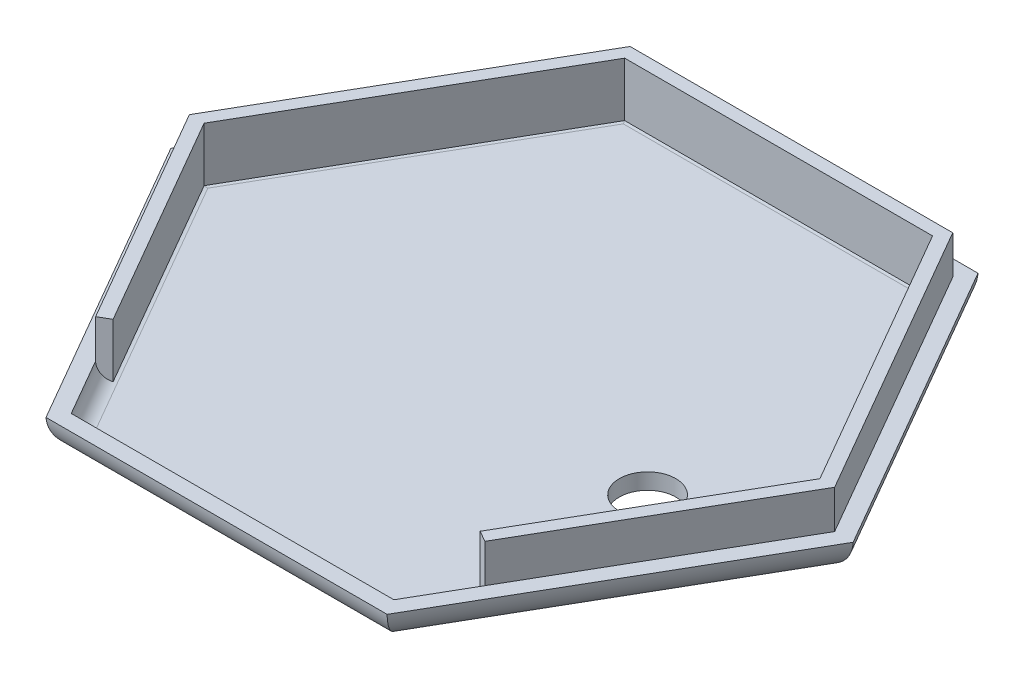
ISO-10303-21;
HEADER;
FILE_DESCRIPTION(('STEP AP214'),'2;1');
FILE_NAME('part.step','',(''),(''),'','','');
FILE_SCHEMA(('AUTOMOTIVE_DESIGN { 1 0 10303 214 1 1 1 1 }'));
ENDSEC;
DATA;
#1=APPLICATION_CONTEXT('core data for automotive mechanical design processes');
#2=APPLICATION_PROTOCOL_DEFINITION('international standard','automotive_design',2000,#1);
#3=PRODUCT_CONTEXT('',#1,'mechanical');
#4=PRODUCT('Part','Part','',(#3));
#5=PRODUCT_RELATED_PRODUCT_CATEGORY('part','',(#4));
#6=PRODUCT_DEFINITION_FORMATION('','',#4);
#7=PRODUCT_DEFINITION_CONTEXT('part definition',#1,'design');
#8=PRODUCT_DEFINITION('design','',#6,#7);
#9=PRODUCT_DEFINITION_SHAPE('','',#8);
#10=(LENGTH_UNIT() NAMED_UNIT(*) SI_UNIT(.MILLI.,.METRE.));
#11=(NAMED_UNIT(*) PLANE_ANGLE_UNIT() SI_UNIT($,.RADIAN.));
#12=(NAMED_UNIT(*) SI_UNIT($,.STERADIAN.) SOLID_ANGLE_UNIT());
#13=UNCERTAINTY_MEASURE_WITH_UNIT(LENGTH_MEASURE(1.E-05),#10,'distance_accuracy_value','');
#14=(GEOMETRIC_REPRESENTATION_CONTEXT(3) GLOBAL_UNCERTAINTY_ASSIGNED_CONTEXT((#13)) GLOBAL_UNIT_ASSIGNED_CONTEXT((#10,
#11,#12)) REPRESENTATION_CONTEXT('',''));
#15=CARTESIAN_POINT('',(0.,0.,0.));
#16=DIRECTION('',(0.,0.,1.));
#17=DIRECTION('',(1.,0.,0.));
#18=AXIS2_PLACEMENT_3D('',#15,#16,#17);
#19=CARTESIAN_POINT('',(0.,0.,0.));
#20=DIRECTION('',(0.,1.,0.));
#21=DIRECTION('',(0.,0.,1.));
#22=AXIS2_PLACEMENT_3D('',#19,#20,#21);
#23=PLANE('',#22);
#24=CARTESIAN_POINT('',(17.4017436721812,0.,1.06507468899997));
#25=DIRECTION('',(0.,1.,0.));
#26=DIRECTION('',(0.,0.,1.));
#27=AXIS2_PLACEMENT_3D('',#24,#25,#26);
#28=CIRCLE('',#27,2.79786320676578);
#29=CARTESIAN_POINT('',(17.4017436721812,0.,3.86293789576575));
#30=VERTEX_POINT('',#29);
#31=EDGE_CURVE('E207',#30,#30,#28,.T.);
#32=ORIENTED_EDGE('',*,*,#31,.T.);
#33=EDGE_LOOP('',(#32));
#34=FACE_BOUND('',#33,.T.);
#35=DIRECTION('',(0.5,0.,-0.866025403784439));
#36=VECTOR('',#35,1.);
#37=CARTESIAN_POINT('',(20.5809107162115,0.,11.8823943421724));
#38=LINE('',#37,#36);
#39=CARTESIAN_POINT('',(29.4451058394209,0.,-3.47084197943052));
#40=VERTEX_POINT('',#39);
#41=CARTESIAN_POINT('',(14.4315622870824,0.,22.533378254868));
#42=VERTEX_POINT('',#41);
#43=EDGE_CURVE('E310',#40,#42,#38,.F.);
#44=ORIENTED_EDGE('',*,*,#43,.T.);
#45=DIRECTION('',(1.,0.,0.));
#46=VECTOR('',#45,1.);
#47=CARTESIAN_POINT('',(0.,0.,22.533378254868));
#48=LINE('',#47,#46);
#49=CARTESIAN_POINT('',(-15.5955248175947,0.,22.533378254868));
#50=VERTEX_POINT('',#49);
#51=EDGE_CURVE('E11',#42,#50,#48,.F.);
#52=ORIENTED_EDGE('',*,*,#51,.T.);
#53=DIRECTION('',(0.5,0.,0.866025403784439));
#54=VECTOR('',#53,1.);
#55=CARTESIAN_POINT('',(-21.4538826140958,0.,12.3864049024108));
#56=LINE('',#55,#54);
#57=CARTESIAN_POINT('',(-30.6090683699332,0.,-3.4708419794305));
#58=VERTEX_POINT('',#57);
#59=EDGE_CURVE('E45',#50,#58,#56,.F.);
#60=ORIENTED_EDGE('',*,*,#59,.T.);
#61=DIRECTION('',(-0.5,0.,0.866025403784439));
#62=VECTOR('',#61,1.);
#63=CARTESIAN_POINT('',(-24.459719940804,0.,-14.1218258921261));
#64=LINE('',#63,#62);
#65=CARTESIAN_POINT('',(-15.5955248175947,0.,-29.475062213729));
#66=VERTEX_POINT('',#65);
#67=EDGE_CURVE('E314',#58,#66,#64,.F.);
#68=ORIENTED_EDGE('',*,*,#67,.T.);
#69=DIRECTION('',(-1.,0.,0.));
#70=VECTOR('',#69,1.);
#71=CARTESIAN_POINT('',(0.,0.,-29.475062213729));
#72=LINE('',#71,#70);
#73=CARTESIAN_POINT('',(14.4315622870824,0.,-29.475062213729));
#74=VERTEX_POINT('',#73);
#75=EDGE_CURVE('E312',#66,#74,#72,.F.);
#76=ORIENTED_EDGE('',*,*,#75,.T.);
#77=DIRECTION('',(-0.5,0.,-0.866025403784439));
#78=VECTOR('',#77,1.);
#79=CARTESIAN_POINT('',(23.5867480429198,0.,-13.6178153318876));
#80=LINE('',#79,#78);
#81=EDGE_CURVE('E293',#74,#40,#80,.F.);
#82=ORIENTED_EDGE('',*,*,#81,.T.);
#83=EDGE_LOOP('',(#44,#52,#60,#68,#76,#82));
#84=FACE_BOUND('',#83,.T.);
#85=ADVANCED_FACE('F36',(#34,#84),#23,.F.);
#86=CARTESIAN_POINT('',(0.,3.175,0.));
#87=DIRECTION('',(0.,1.,0.));
#88=DIRECTION('',(0.,0.,1.));
#89=AXIS2_PLACEMENT_3D('',#86,#87,#88);
#90=PLANE('',#89);
#91=DIRECTION('',(-0.5,0.,-0.866025403784439));
#92=VECTOR('',#91,1.);
#93=CARTESIAN_POINT('',(26.4442480429198,3.175,-15.267593726097));
#94=LINE('',#93,#92);
#95=CARTESIAN_POINT('',(33.2551058394209,3.175,-3.47084197943051));
#96=VERTEX_POINT('',#95);
#97=CARTESIAN_POINT('',(16.3365622870824,3.175,-32.7746190021477));
#98=VERTEX_POINT('',#97);
#99=EDGE_CURVE('E247',#96,#98,#94,.T.);
#100=ORIENTED_EDGE('',*,*,#99,.T.);
#101=DIRECTION('',(-1.,0.,0.));
#102=VECTOR('',#101,1.);
#103=CARTESIAN_POINT('',(0.,3.175,-32.7746190021477));
#104=LINE('',#103,#102);
#105=CARTESIAN_POINT('',(-17.5005248175946,3.175,-32.7746190021477));
#106=VERTEX_POINT('',#105);
#107=EDGE_CURVE('E249',#98,#106,#104,.T.);
#108=ORIENTED_EDGE('',*,*,#107,.T.);
#109=DIRECTION('',(-0.5,0.,0.866025403784439));
#110=VECTOR('',#109,1.);
#111=CARTESIAN_POINT('',(-27.317219940804,3.175,-15.7716042863354));
#112=LINE('',#111,#110);
#113=CARTESIAN_POINT('',(-34.4190683699332,3.175,-3.4708419794305));
#114=VERTEX_POINT('',#113);
#115=EDGE_CURVE('E252',#106,#114,#112,.T.);
#116=ORIENTED_EDGE('',*,*,#115,.T.);
#117=DIRECTION('',(0.5,0.,0.866025403784439));
#118=VECTOR('',#117,1.);
#119=CARTESIAN_POINT('',(-24.3113826140958,3.175,14.0361832966202));
#120=LINE('',#119,#118);
#121=CARTESIAN_POINT('',(-17.5005248175947,3.175,25.8329350432867));
#122=VERTEX_POINT('',#121);
#123=EDGE_CURVE('E254',#114,#122,#120,.T.);
#124=ORIENTED_EDGE('',*,*,#123,.T.);
#125=DIRECTION('',(1.,0.,0.));
#126=VECTOR('',#125,1.);
#127=CARTESIAN_POINT('',(0.,3.175,25.8329350432867));
#128=LINE('',#127,#126);
#129=CARTESIAN_POINT('',(16.3365622870824,3.175,25.8329350432867));
#130=VERTEX_POINT('',#129);
#131=EDGE_CURVE('E256',#122,#130,#128,.T.);
#132=ORIENTED_EDGE('',*,*,#131,.T.);
#133=DIRECTION('',(0.5,0.,-0.866025403784439));
#134=VECTOR('',#133,1.);
#135=CARTESIAN_POINT('',(23.4384107162115,3.175,13.5321727363817));
#136=LINE('',#135,#134);
#137=EDGE_CURVE('E259',#130,#96,#136,.T.);
#138=ORIENTED_EDGE('',*,*,#137,.T.);
#139=EDGE_LOOP('',(#100,#108,#116,#124,#132,#138));
#140=FACE_BOUND('',#139,.T.);
#141=DIRECTION('',(-0.5,0.,-0.866025403784439));
#142=VECTOR('',#141,1.);
#143=CARTESIAN_POINT('',(-22.936567285588,3.175,13.2424332966202));
#144=LINE('',#143,#142);
#145=CARTESIAN_POINT('',(-16.5839812652561,3.175,24.2454350432867));
#146=VERTEX_POINT('',#145);
#147=CARTESIAN_POINT('',(-19.8859812652561,3.175,18.5262032766942));
#148=VERTEX_POINT('',#147);
#149=EDGE_CURVE('E261',#146,#148,#144,.T.);
#150=ORIENTED_EDGE('',*,*,#149,.T.);
#151=DIRECTION('',(0.5,0.,0.866025403784439));
#152=VECTOR('',#151,1.);
#153=CARTESIAN_POINT('',(-32.5859812652561,3.175,-3.47084197943051));
#154=LINE('',#153,#152);
#155=CARTESIAN_POINT('',(-32.5859812652561,3.175,-3.47084197943051));
#156=VERTEX_POINT('',#155);
#157=EDGE_CURVE('E211',#156,#148,#154,.T.);
#158=ORIENTED_EDGE('',*,*,#157,.F.);
#159=DIRECTION('',(0.5,0.,-0.866025403784439));
#160=VECTOR('',#159,1.);
#161=CARTESIAN_POINT('',(-25.9424046122962,3.175,-14.9778542863354));
#162=LINE('',#161,#160);
#163=CARTESIAN_POINT('',(-16.5839812652561,3.175,-31.1871190021477));
#164=VERTEX_POINT('',#163);
#165=EDGE_CURVE('E264',#156,#164,#162,.T.);
#166=ORIENTED_EDGE('',*,*,#165,.T.);
#167=DIRECTION('',(1.,0.,0.));
#168=VECTOR('',#167,1.);
#169=CARTESIAN_POINT('',(0.,3.175,-31.1871190021477));
#170=LINE('',#169,#168);
#171=CARTESIAN_POINT('',(15.4200187347439,3.175,-31.1871190021477));
#172=VERTEX_POINT('',#171);
#173=EDGE_CURVE('E267',#164,#172,#170,.T.);
#174=ORIENTED_EDGE('',*,*,#173,.T.);
#175=DIRECTION('',(0.5,0.,0.866025403784439));
#176=VECTOR('',#175,1.);
#177=CARTESIAN_POINT('',(25.069432714412,3.175,-14.473843726097));
#178=LINE('',#177,#176);
#179=CARTESIAN_POINT('',(31.4220187347439,3.175,-3.47084197943051));
#180=VERTEX_POINT('',#179);
#181=EDGE_CURVE('E270',#172,#180,#178,.T.);
#182=ORIENTED_EDGE('',*,*,#181,.T.);
#183=DIRECTION('',(-0.5,0.,0.866025403784439));
#184=VECTOR('',#183,1.);
#185=CARTESIAN_POINT('',(22.0635953877038,3.175,12.7384227363817));
#186=LINE('',#185,#184);
#187=CARTESIAN_POINT('',(18.7220187347439,3.175,18.5262032766942));
#188=VERTEX_POINT('',#187);
#189=EDGE_CURVE('E274',#180,#188,#186,.T.);
#190=ORIENTED_EDGE('',*,*,#189,.T.);
#191=CARTESIAN_POINT('',(15.4200187347439,3.175,24.2454350432867));
#192=VERTEX_POINT('',#191);
#193=EDGE_CURVE('E273',#188,#192,#186,.T.);
#194=ORIENTED_EDGE('',*,*,#193,.T.);
#195=DIRECTION('',(-1.,0.,0.));
#196=VECTOR('',#195,1.);
#197=CARTESIAN_POINT('',(0.,3.175,24.2454350432867));
#198=LINE('',#197,#196);
#199=EDGE_CURVE('E277',#192,#146,#198,.T.);
#200=ORIENTED_EDGE('',*,*,#199,.T.);
#201=EDGE_LOOP('',(#150,#158,#166,#174,#182,#190,#194,#200));
#202=FACE_BOUND('',#201,.T.);
#203=ADVANCED_FACE('F348',(#140,#202),#90,.T.);
#204=CARTESIAN_POINT('',(0.,1.5875,0.));
#205=DIRECTION('',(0.,1.,0.));
#206=DIRECTION('',(0.,0.,1.));
#207=AXIS2_PLACEMENT_3D('',#204,#205,#206);
#208=PLANE('',#207);
#209=CARTESIAN_POINT('',(17.4017436721812,1.5875,1.06507468899997));
#210=DIRECTION('',(0.,1.,0.));
#211=DIRECTION('',(0.,0.,1.));
#212=AXIS2_PLACEMENT_3D('',#209,#210,#211);
#213=CIRCLE('',#212,2.79786320676578);
#214=CARTESIAN_POINT('',(17.4017436721812,1.5875,3.86293789576575));
#215=VERTEX_POINT('',#214);
#216=EDGE_CURVE('E456',#215,#215,#213,.T.);
#217=ORIENTED_EDGE('',*,*,#216,.F.);
#218=EDGE_LOOP('',(#217));
#219=FACE_BOUND('',#218,.T.);
#220=DIRECTION('',(0.5,0.,0.866025403784439));
#221=VECTOR('',#220,1.);
#222=CARTESIAN_POINT('',(23.6946173859043,1.5875,-13.680093726097));
#223=LINE('',#222,#221);
#224=CARTESIAN_POINT('',(29.5889316300668,1.5875,-3.47084197943052));
#225=VERTEX_POINT('',#224);
#226=CARTESIAN_POINT('',(14.5034751824053,1.5875,-29.5996190021477));
#227=VERTEX_POINT('',#226);
#228=EDGE_CURVE('E288',#225,#227,#223,.F.);
#229=ORIENTED_EDGE('',*,*,#228,.T.);
#230=DIRECTION('',(1.,0.,0.));
#231=VECTOR('',#230,1.);
#232=CARTESIAN_POINT('',(0.,1.5875,-29.5996190021477));
#233=LINE('',#232,#231);
#234=CARTESIAN_POINT('',(-15.6674377129176,1.5875,-29.5996190021477));
#235=VERTEX_POINT('',#234);
#236=EDGE_CURVE('E290',#227,#235,#233,.F.);
#237=ORIENTED_EDGE('',*,*,#236,.T.);
#238=DIRECTION('',(0.5,0.,-0.866025403784439));
#239=VECTOR('',#238,1.);
#240=CARTESIAN_POINT('',(-24.5675892837884,1.5875,-14.1841042863354));
#241=LINE('',#240,#239);
#242=CARTESIAN_POINT('',(-30.7528941605791,1.5875,-3.47084197943051));
#243=VERTEX_POINT('',#242);
#244=EDGE_CURVE('E283',#235,#243,#241,.F.);
#245=ORIENTED_EDGE('',*,*,#244,.T.);
#246=DIRECTION('',(-0.5,0.,-0.866025403784439));
#247=VECTOR('',#246,1.);
#248=CARTESIAN_POINT('',(-21.5617519570802,1.5875,12.4486832966202));
#249=LINE('',#248,#247);
#250=CARTESIAN_POINT('',(-15.6674377129176,1.5875,22.6579350432867));
#251=VERTEX_POINT('',#250);
#252=EDGE_CURVE('E279',#243,#251,#249,.F.);
#253=ORIENTED_EDGE('',*,*,#252,.T.);
#254=DIRECTION('',(-1.,0.,0.));
#255=VECTOR('',#254,1.);
#256=CARTESIAN_POINT('',(0.,1.5875,22.6579350432867));
#257=LINE('',#256,#255);
#258=CARTESIAN_POINT('',(14.5034751824053,1.5875,22.6579350432867));
#259=VERTEX_POINT('',#258);
#260=EDGE_CURVE('E281',#251,#259,#257,.F.);
#261=ORIENTED_EDGE('',*,*,#260,.T.);
#262=DIRECTION('',(-0.5,0.,0.866025403784439));
#263=VECTOR('',#262,1.);
#264=CARTESIAN_POINT('',(20.688780059196,1.5875,11.9446727363817));
#265=LINE('',#264,#263);
#266=EDGE_CURVE('E286',#259,#225,#265,.F.);
#267=ORIENTED_EDGE('',*,*,#266,.T.);
#268=EDGE_LOOP('',(#229,#237,#245,#253,#261,#267));
#269=FACE_BOUND('',#268,.T.);
#270=ADVANCED_FACE('F367',(#219,#269),#208,.T.);
#271=CARTESIAN_POINT('',(0.,3.175,22.6579350432867));
#272=DIRECTION('',(-1.,0.,0.));
#273=DIRECTION('',(0.,0.,1.));
#274=AXIS2_PLACEMENT_3D('',#271,#272,#273);
#275=CYLINDRICAL_SURFACE('',#274,1.5875);
#276=CARTESIAN_POINT('',(14.5034751824053,3.175,22.6579350432867));
#277=DIRECTION('',(-0.866025403784439,0.,0.5));
#278=DIRECTION('',(0.5,0.,0.866025403784439));
#279=AXIS2_PLACEMENT_3D('',#276,#277,#278);
#280=ELLIPSE('',#279,1.83308710467706,1.5875);
#281=EDGE_CURVE('E304',#259,#192,#280,.T.);
#282=ORIENTED_EDGE('',*,*,#281,.F.);
#283=ORIENTED_EDGE('',*,*,#260,.F.);
#284=CARTESIAN_POINT('',(-15.6674377129176,3.175,22.6579350432867));
#285=DIRECTION('',(-0.866025403784438,0.,-0.5));
#286=DIRECTION('',(-0.5,0.,0.866025403784439));
#287=AXIS2_PLACEMENT_3D('',#284,#285,#286);
#288=ELLIPSE('',#287,1.83308710467706,1.5875);
#289=EDGE_CURVE('E250',#146,#251,#288,.F.);
#290=ORIENTED_EDGE('',*,*,#289,.F.);
#291=ORIENTED_EDGE('',*,*,#199,.F.);
#292=EDGE_LOOP('',(#282,#283,#290,#291));
#293=FACE_BOUND('',#292,.T.);
#294=ADVANCED_FACE('F391',(#293),#275,.F.);
#295=CARTESIAN_POINT('',(-21.5617519570802,3.175,12.4486832966202));
#296=DIRECTION('',(-0.5,0.,-0.866025403784439));
#297=DIRECTION('',(-0.866025403784439,0.,0.5));
#298=AXIS2_PLACEMENT_3D('',#295,#296,#297);
#299=CYLINDRICAL_SURFACE('',#298,1.5875);
#300=CARTESIAN_POINT('',(-30.7528941605791,3.175,-3.47084197943051));
#301=DIRECTION('',(0.,0.,-1.));
#302=DIRECTION('',(1.,0.,0.));
#303=AXIS2_PLACEMENT_3D('',#300,#301,#302);
#304=ELLIPSE('',#303,1.83308710467706,1.5875);
#305=CARTESIAN_POINT('',(-31.1195115815145,1.6195740130911,-3.47084197943051));
#306=VERTEX_POINT('',#305);
#307=EDGE_CURVE('E302',#306,#243,#304,.F.);
#308=ORIENTED_EDGE('',*,*,#307,.F.);
#309=DIRECTION('',(-0.5,0.,-0.866025403784439));
#310=VECTOR('',#309,1.);
#311=CARTESIAN_POINT('',(-21.8367150227817,1.61957401333268,12.6074332966202));
#312=LINE('',#311,#310);
#313=CARTESIAN_POINT('',(-18.7861290024499,1.61957401331847,17.8912032766942));
#314=VERTEX_POINT('',#313);
#315=EDGE_CURVE('E233',#314,#306,#312,.T.);
#316=ORIENTED_EDGE('',*,*,#315,.F.);
#317=CARTESIAN_POINT('',(-18.5111659367483,3.175,17.7324532766942));
#318=DIRECTION('',(0.499999999999996,0.,0.866025403784441));
#319=DIRECTION('',(0.866025403784441,0.,-0.499999999999996));
#320=AXIS2_PLACEMENT_3D('',#317,#318,#319);
#321=CIRCLE('',#320,1.5875);
#322=EDGE_CURVE('E235',#148,#314,#321,.T.);
#323=ORIENTED_EDGE('',*,*,#322,.F.);
#324=ORIENTED_EDGE('',*,*,#149,.F.);
#325=ORIENTED_EDGE('',*,*,#289,.T.);
#326=ORIENTED_EDGE('',*,*,#252,.F.);
#327=EDGE_LOOP('',(#308,#316,#323,#324,#325,#326));
#328=FACE_BOUND('',#327,.T.);
#329=ADVANCED_FACE('F387',(#328),#299,.F.);
#330=CARTESIAN_POINT('',(20.688780059196,3.175,11.9446727363817));
#331=DIRECTION('',(-0.5,0.,0.866025403784439));
#332=DIRECTION('',(0.866025403784439,0.,0.5));
#333=AXIS2_PLACEMENT_3D('',#330,#331,#332);
#334=CYLINDRICAL_SURFACE('',#333,1.5875);
#335=ORIENTED_EDGE('',*,*,#193,.F.);
#336=CARTESIAN_POINT('',(17.3472034062361,3.175,17.7324532766942));
#337=DIRECTION('',(-0.499999999999995,0.,0.866025403784442));
#338=DIRECTION('',(0.866025403784442,0.,0.499999999999995));
#339=AXIS2_PLACEMENT_3D('',#336,#337,#338);
#340=CIRCLE('',#339,1.5875);
#341=CARTESIAN_POINT('',(17.6221664719376,1.61957401333268,17.8912032766942));
#342=VERTEX_POINT('',#341);
#343=EDGE_CURVE('E223',#342,#188,#340,.T.);
#344=ORIENTED_EDGE('',*,*,#343,.F.);
#345=DIRECTION('',(-0.5,0.,0.866025403784439));
#346=VECTOR('',#345,1.);
#347=CARTESIAN_POINT('',(20.9637431248975,1.61957401333268,12.1034227363818));
#348=LINE('',#347,#346);
#349=CARTESIAN_POINT('',(29.9555490510022,1.61957401331847,-3.4708419794305));
#350=VERTEX_POINT('',#349);
#351=EDGE_CURVE('E244',#350,#342,#348,.T.);
#352=ORIENTED_EDGE('',*,*,#351,.F.);
#353=CARTESIAN_POINT('',(29.5889316300668,3.175,-3.47084197943052));
#354=DIRECTION('',(0.,0.,1.));
#355=DIRECTION('',(1.,0.,0.));
#356=AXIS2_PLACEMENT_3D('',#353,#354,#355);
#357=ELLIPSE('',#356,1.83308710467706,1.5875);
#358=EDGE_CURVE('E299',#225,#350,#357,.T.);
#359=ORIENTED_EDGE('',*,*,#358,.F.);
#360=ORIENTED_EDGE('',*,*,#266,.F.);
#361=ORIENTED_EDGE('',*,*,#281,.T.);
#362=EDGE_LOOP('',(#335,#344,#352,#359,#360,#361));
#363=FACE_BOUND('',#362,.T.);
#364=ADVANCED_FACE('F383',(#363),#334,.F.);
#365=CARTESIAN_POINT('',(-24.5675892837884,3.175,-14.1841042863354));
#366=DIRECTION('',(0.5,0.,-0.866025403784439));
#367=DIRECTION('',(-0.866025403784439,0.,-0.5));
#368=AXIS2_PLACEMENT_3D('',#365,#366,#367);
#369=CYLINDRICAL_SURFACE('',#368,1.5875);
#370=CARTESIAN_POINT('',(-15.6674377129176,3.175,-29.5996190021477));
#371=DIRECTION('',(0.866025403784439,0.,-0.5));
#372=DIRECTION('',(0.5,0.,0.866025403784439));
#373=AXIS2_PLACEMENT_3D('',#370,#371,#372);
#374=ELLIPSE('',#373,1.83308710467706,1.5875);
#375=CARTESIAN_POINT('',(-15.8507464233853,1.61957401331847,-29.9171190021477));
#376=VERTEX_POINT('',#375);
#377=EDGE_CURVE('E297',#376,#235,#374,.F.);
#378=ORIENTED_EDGE('',*,*,#377,.F.);
#379=DIRECTION('',(0.5,0.,-0.866025403784439));
#380=VECTOR('',#379,1.);
#381=CARTESIAN_POINT('',(-24.84255234949,1.61957401333268,-14.3428542863354));
#382=LINE('',#381,#380);
#383=EDGE_CURVE('E236',#306,#376,#382,.T.);
#384=ORIENTED_EDGE('',*,*,#383,.F.);
#385=ORIENTED_EDGE('',*,*,#307,.T.);
#386=ORIENTED_EDGE('',*,*,#244,.F.);
#387=EDGE_LOOP('',(#378,#384,#385,#386));
#388=FACE_BOUND('',#387,.T.);
#389=ADVANCED_FACE('F379',(#388),#369,.F.);
#390=CARTESIAN_POINT('',(23.6946173859043,3.175,-13.680093726097));
#391=DIRECTION('',(0.5,0.,0.866025403784439));
#392=DIRECTION('',(0.866025403784439,0.,-0.5));
#393=AXIS2_PLACEMENT_3D('',#390,#391,#392);
#394=CYLINDRICAL_SURFACE('',#393,1.5875);
#395=ORIENTED_EDGE('',*,*,#358,.T.);
#396=DIRECTION('',(0.5,0.,0.866025403784439));
#397=VECTOR('',#396,1.);
#398=CARTESIAN_POINT('',(23.9695804516058,1.61957401333268,-13.838843726097));
#399=LINE('',#398,#397);
#400=CARTESIAN_POINT('',(14.686783892873,1.61957401331847,-29.9171190021477));
#401=VERTEX_POINT('',#400);
#402=EDGE_CURVE('E242',#401,#350,#399,.T.);
#403=ORIENTED_EDGE('',*,*,#402,.F.);
#404=CARTESIAN_POINT('',(14.5034751824053,3.175,-29.5996190021477));
#405=DIRECTION('',(0.866025403784439,0.,0.5));
#406=DIRECTION('',(0.5,0.,-0.866025403784439));
#407=AXIS2_PLACEMENT_3D('',#404,#405,#406);
#408=ELLIPSE('',#407,1.83308710467706,1.5875);
#409=EDGE_CURVE('E294',#227,#401,#408,.T.);
#410=ORIENTED_EDGE('',*,*,#409,.F.);
#411=ORIENTED_EDGE('',*,*,#228,.F.);
#412=EDGE_LOOP('',(#395,#403,#410,#411));
#413=FACE_BOUND('',#412,.T.);
#414=ADVANCED_FACE('F375',(#413),#394,.F.);
#415=CARTESIAN_POINT('',(0.,3.175,-29.5996190021477));
#416=DIRECTION('',(1.,0.,0.));
#417=DIRECTION('',(0.,0.,-1.));
#418=AXIS2_PLACEMENT_3D('',#415,#416,#417);
#419=CYLINDRICAL_SURFACE('',#418,1.5875);
#420=ORIENTED_EDGE('',*,*,#409,.T.);
#421=DIRECTION('',(1.,0.,0.));
#422=VECTOR('',#421,1.);
#423=CARTESIAN_POINT('',(0.,1.61957401333268,-29.9171190021477));
#424=LINE('',#423,#422);
#425=EDGE_CURVE('E240',#376,#401,#424,.T.);
#426=ORIENTED_EDGE('',*,*,#425,.F.);
#427=ORIENTED_EDGE('',*,*,#377,.T.);
#428=ORIENTED_EDGE('',*,*,#236,.F.);
#429=EDGE_LOOP('',(#420,#426,#427,#428));
#430=FACE_BOUND('',#429,.T.);
#431=ADVANCED_FACE('F372',(#430),#419,.F.);
#432=CARTESIAN_POINT('',(0.,3.302,-29.475062213729));
#433=DIRECTION('',(-1.,0.,0.));
#434=DIRECTION('',(0.,0.,1.));
#435=AXIS2_PLACEMENT_3D('',#432,#433,#434);
#436=CYLINDRICAL_SURFACE('',#435,3.302);
#437=CARTESIAN_POINT('',(14.4315622870824,3.302,-29.475062213729));
#438=DIRECTION('',(-0.866025403784439,0.,-0.5));
#439=DIRECTION('',(0.5,0.,-0.866025403784439));
#440=AXIS2_PLACEMENT_3D('',#437,#438,#439);
#441=ELLIPSE('',#440,3.81282117772829,3.302);
#442=EDGE_CURVE('E324',#74,#98,#441,.F.);
#443=ORIENTED_EDGE('',*,*,#442,.F.);
#444=ORIENTED_EDGE('',*,*,#75,.F.);
#445=CARTESIAN_POINT('',(-15.5955248175947,3.302,-29.475062213729));
#446=DIRECTION('',(-0.866025403784439,0.,0.5));
#447=DIRECTION('',(-0.5,0.,-0.866025403784439));
#448=AXIS2_PLACEMENT_3D('',#445,#446,#447);
#449=ELLIPSE('',#448,3.81282117772829,3.302);
#450=EDGE_CURVE('E40',#106,#66,#449,.T.);
#451=ORIENTED_EDGE('',*,*,#450,.F.);
#452=ORIENTED_EDGE('',*,*,#107,.F.);
#453=EDGE_LOOP('',(#443,#444,#451,#452));
#454=FACE_BOUND('',#453,.T.);
#455=ADVANCED_FACE('F38',(#454),#436,.T.);
#456=CARTESIAN_POINT('',(-24.459719940804,3.302,-14.1218258921261));
#457=DIRECTION('',(-0.5,0.,0.866025403784439));
#458=DIRECTION('',(0.866025403784439,0.,0.5));
#459=AXIS2_PLACEMENT_3D('',#456,#457,#458);
#460=CYLINDRICAL_SURFACE('',#459,3.302);
#461=ORIENTED_EDGE('',*,*,#450,.T.);
#462=ORIENTED_EDGE('',*,*,#67,.F.);
#463=CARTESIAN_POINT('',(-30.6090683699332,3.302,-3.47084197943049));
#464=DIRECTION('',(0.,0.,1.));
#465=DIRECTION('',(-1.,0.,0.));
#466=AXIS2_PLACEMENT_3D('',#463,#464,#465);
#467=ELLIPSE('',#466,3.81282117772829,3.302);
#468=EDGE_CURVE('E322',#114,#58,#467,.T.);
#469=ORIENTED_EDGE('',*,*,#468,.F.);
#470=ORIENTED_EDGE('',*,*,#115,.F.);
#471=EDGE_LOOP('',(#461,#462,#469,#470));
#472=FACE_BOUND('',#471,.T.);
#473=ADVANCED_FACE('F334',(#472),#460,.T.);
#474=CARTESIAN_POINT('',(23.5867480429198,3.302,-13.6178153318876));
#475=DIRECTION('',(-0.5,0.,-0.866025403784439));
#476=DIRECTION('',(-0.866025403784439,0.,0.5));
#477=AXIS2_PLACEMENT_3D('',#474,#475,#476);
#478=CYLINDRICAL_SURFACE('',#477,3.302);
#479=ORIENTED_EDGE('',*,*,#442,.T.);
#480=ORIENTED_EDGE('',*,*,#99,.F.);
#481=CARTESIAN_POINT('',(29.4451058394209,3.302,-3.47084197943052));
#482=DIRECTION('',(0.,0.,-1.));
#483=DIRECTION('',(-1.,0.,0.));
#484=AXIS2_PLACEMENT_3D('',#481,#482,#483);
#485=ELLIPSE('',#484,3.81282117772829,3.302);
#486=EDGE_CURVE('E319',#40,#96,#485,.F.);
#487=ORIENTED_EDGE('',*,*,#486,.F.);
#488=ORIENTED_EDGE('',*,*,#81,.F.);
#489=EDGE_LOOP('',(#479,#480,#487,#488));
#490=FACE_BOUND('',#489,.T.);
#491=ADVANCED_FACE('F341',(#490),#478,.T.);
#492=CARTESIAN_POINT('',(-21.4538826140958,3.302,12.3864049024108));
#493=DIRECTION('',(0.5,0.,0.866025403784439));
#494=DIRECTION('',(0.866025403784439,0.,-0.5));
#495=AXIS2_PLACEMENT_3D('',#492,#493,#494);
#496=CYLINDRICAL_SURFACE('',#495,3.302);
#497=ORIENTED_EDGE('',*,*,#468,.T.);
#498=ORIENTED_EDGE('',*,*,#59,.F.);
#499=CARTESIAN_POINT('',(-15.5955248175947,3.302,22.533378254868));
#500=DIRECTION('',(0.866025403784438,0.,0.5));
#501=DIRECTION('',(-0.5,0.,0.866025403784439));
#502=AXIS2_PLACEMENT_3D('',#499,#500,#501);
#503=ELLIPSE('',#502,3.81282117772829,3.302);
#504=EDGE_CURVE('E53',#122,#50,#503,.T.);
#505=ORIENTED_EDGE('',*,*,#504,.F.);
#506=ORIENTED_EDGE('',*,*,#123,.F.);
#507=EDGE_LOOP('',(#497,#498,#505,#506));
#508=FACE_BOUND('',#507,.T.);
#509=ADVANCED_FACE('F352',(#508),#496,.T.);
#510=CARTESIAN_POINT('',(20.5809107162115,3.302,11.8823943421724));
#511=DIRECTION('',(0.5,0.,-0.866025403784439));
#512=DIRECTION('',(-0.866025403784439,0.,-0.5));
#513=AXIS2_PLACEMENT_3D('',#510,#511,#512);
#514=CYLINDRICAL_SURFACE('',#513,3.302);
#515=ORIENTED_EDGE('',*,*,#486,.T.);
#516=ORIENTED_EDGE('',*,*,#137,.F.);
#517=CARTESIAN_POINT('',(14.4315622870824,3.302,22.533378254868));
#518=DIRECTION('',(0.866025403784439,0.,-0.5));
#519=DIRECTION('',(-0.5,0.,-0.866025403784439));
#520=AXIS2_PLACEMENT_3D('',#517,#518,#519);
#521=ELLIPSE('',#520,3.81282117772829,3.302);
#522=EDGE_CURVE('E238',#42,#130,#521,.F.);
#523=ORIENTED_EDGE('',*,*,#522,.F.);
#524=ORIENTED_EDGE('',*,*,#43,.F.);
#525=EDGE_LOOP('',(#515,#516,#523,#524));
#526=FACE_BOUND('',#525,.T.);
#527=ADVANCED_FACE('F345',(#526),#514,.T.);
#528=CARTESIAN_POINT('',(0.,3.302,22.533378254868));
#529=DIRECTION('',(1.,0.,0.));
#530=DIRECTION('',(0.,0.,-1.));
#531=AXIS2_PLACEMENT_3D('',#528,#529,#530);
#532=CYLINDRICAL_SURFACE('',#531,3.302);
#533=ORIENTED_EDGE('',*,*,#504,.T.);
#534=ORIENTED_EDGE('',*,*,#51,.F.);
#535=ORIENTED_EDGE('',*,*,#522,.T.);
#536=ORIENTED_EDGE('',*,*,#131,.F.);
#537=EDGE_LOOP('',(#533,#534,#535,#536));
#538=FACE_BOUND('',#537,.T.);
#539=ADVANCED_FACE('F346',(#538),#532,.T.);
#540=CARTESIAN_POINT('',(18.7220187347439,-500000.,18.5262032766942));
#541=DIRECTION('',(-0.499999999999995,0.,0.866025403784442));
#542=DIRECTION('',(0.866025403784442,0.,0.499999999999995));
#543=AXIS2_PLACEMENT_3D('',#540,#541,#542);
#544=PLANE('',#543);
#545=DIRECTION('',(0.,1.,0.));
#546=VECTOR('',#545,1.);
#547=CARTESIAN_POINT('',(17.6221664719376,-500000.,17.8912032766942));
#548=LINE('',#547,#546);
#549=CARTESIAN_POINT('',(17.6221664719376,6.985,17.8912032766942));
#550=VERTEX_POINT('',#549);
#551=EDGE_CURVE('E215',#342,#550,#548,.T.);
#552=ORIENTED_EDGE('',*,*,#551,.F.);
#553=ORIENTED_EDGE('',*,*,#343,.T.);
#554=DIRECTION('',(0.,-1.,0.));
#555=VECTOR('',#554,1.);
#556=CARTESIAN_POINT('',(18.7220187347439,6.985,18.5262032766942));
#557=LINE('',#556,#555);
#558=CARTESIAN_POINT('',(18.7220187347439,6.985,18.5262032766942));
#559=VERTEX_POINT('',#558);
#560=EDGE_CURVE('E213',#559,#188,#557,.T.);
#561=ORIENTED_EDGE('',*,*,#560,.F.);
#562=DIRECTION('',(0.866025403784442,0.,0.499999999999995));
#563=VECTOR('',#562,1.);
#564=CARTESIAN_POINT('',(18.7220187347439,6.985,18.5262032766942));
#565=LINE('',#564,#563);
#566=EDGE_CURVE('E474',#550,#559,#565,.T.);
#567=ORIENTED_EDGE('',*,*,#566,.F.);
#568=EDGE_LOOP('',(#552,#553,#561,#567));
#569=FACE_BOUND('',#568,.T.);
#570=ADVANCED_FACE('F397',(#569),#544,.T.);
#571=CARTESIAN_POINT('',(29.9555490510022,-500000.,-3.4708419794305));
#572=DIRECTION('',(-0.866025403784439,0.,-0.5));
#573=DIRECTION('',(-0.5,0.,0.866025403784439));
#574=AXIS2_PLACEMENT_3D('',#571,#572,#573);
#575=PLANE('',#574);
#576=DIRECTION('',(0.,1.,0.));
#577=VECTOR('',#576,1.);
#578=CARTESIAN_POINT('',(29.9555490510022,-500000.,-3.4708419794305));
#579=LINE('',#578,#577);
#580=CARTESIAN_POINT('',(29.9555490510022,6.985,-3.4708419794305));
#581=VERTEX_POINT('',#580);
#582=EDGE_CURVE('E230',#350,#581,#579,.T.);
#583=ORIENTED_EDGE('',*,*,#582,.F.);
#584=ORIENTED_EDGE('',*,*,#351,.T.);
#585=ORIENTED_EDGE('',*,*,#551,.T.);
#586=DIRECTION('',(-0.5,0.,0.866025403784439));
#587=VECTOR('',#586,1.);
#588=CARTESIAN_POINT('',(29.9555490510022,6.985,-3.4708419794305));
#589=LINE('',#588,#587);
#590=EDGE_CURVE('E471',#581,#550,#589,.T.);
#591=ORIENTED_EDGE('',*,*,#590,.F.);
#592=EDGE_LOOP('',(#583,#584,#585,#591));
#593=FACE_BOUND('',#592,.T.);
#594=ADVANCED_FACE('F401',(#593),#575,.T.);
#595=CARTESIAN_POINT('',(14.686783892873,-500000.,-29.9171190021477));
#596=DIRECTION('',(-0.866025403784439,0.,0.5));
#597=DIRECTION('',(0.5,0.,0.866025403784439));
#598=AXIS2_PLACEMENT_3D('',#595,#596,#597);
#599=PLANE('',#598);
#600=DIRECTION('',(0.,1.,0.));
#601=VECTOR('',#600,1.);
#602=CARTESIAN_POINT('',(14.686783892873,-500000.,-29.9171190021477));
#603=LINE('',#602,#601);
#604=CARTESIAN_POINT('',(14.686783892873,6.985,-29.9171190021477));
#605=VERTEX_POINT('',#604);
#606=EDGE_CURVE('E228',#401,#605,#603,.T.);
#607=ORIENTED_EDGE('',*,*,#606,.F.);
#608=ORIENTED_EDGE('',*,*,#402,.T.);
#609=ORIENTED_EDGE('',*,*,#582,.T.);
#610=DIRECTION('',(0.5,0.,0.866025403784439));
#611=VECTOR('',#610,1.);
#612=CARTESIAN_POINT('',(14.686783892873,6.985,-29.9171190021477));
#613=LINE('',#612,#611);
#614=EDGE_CURVE('E468',#605,#581,#613,.T.);
#615=ORIENTED_EDGE('',*,*,#614,.F.);
#616=EDGE_LOOP('',(#607,#608,#609,#615));
#617=FACE_BOUND('',#616,.T.);
#618=ADVANCED_FACE('F423',(#617),#599,.T.);
#619=CARTESIAN_POINT('',(-15.8507464233853,-500000.,-29.9171190021477));
#620=DIRECTION('',(0.,0.,1.));
#621=DIRECTION('',(1.,0.,0.));
#622=AXIS2_PLACEMENT_3D('',#619,#620,#621);
#623=PLANE('',#622);
#624=DIRECTION('',(0.,1.,0.));
#625=VECTOR('',#624,1.);
#626=CARTESIAN_POINT('',(-15.8507464233853,-500000.,-29.9171190021477));
#627=LINE('',#626,#625);
#628=CARTESIAN_POINT('',(-15.8507464233853,6.985,-29.9171190021477));
#629=VERTEX_POINT('',#628);
#630=EDGE_CURVE('E226',#376,#629,#627,.T.);
#631=ORIENTED_EDGE('',*,*,#630,.F.);
#632=ORIENTED_EDGE('',*,*,#425,.T.);
#633=ORIENTED_EDGE('',*,*,#606,.T.);
#634=DIRECTION('',(1.,0.,0.));
#635=VECTOR('',#634,1.);
#636=CARTESIAN_POINT('',(-15.8507464233853,6.985,-29.9171190021477));
#637=LINE('',#636,#635);
#638=EDGE_CURVE('E465',#629,#605,#637,.T.);
#639=ORIENTED_EDGE('',*,*,#638,.F.);
#640=EDGE_LOOP('',(#631,#632,#633,#639));
#641=FACE_BOUND('',#640,.T.);
#642=ADVANCED_FACE('F419',(#641),#623,.T.);
#643=CARTESIAN_POINT('',(-31.1195115815145,-500000.,-3.47084197943051));
#644=DIRECTION('',(0.866025403784439,0.,0.5));
#645=DIRECTION('',(0.5,0.,-0.866025403784439));
#646=AXIS2_PLACEMENT_3D('',#643,#644,#645);
#647=PLANE('',#646);
#648=DIRECTION('',(0.,1.,0.));
#649=VECTOR('',#648,1.);
#650=CARTESIAN_POINT('',(-31.1195115815145,-500000.,-3.47084197943051));
#651=LINE('',#650,#649);
#652=CARTESIAN_POINT('',(-31.1195115815145,6.985,-3.47084197943051));
#653=VERTEX_POINT('',#652);
#654=EDGE_CURVE('E224',#306,#653,#651,.T.);
#655=ORIENTED_EDGE('',*,*,#654,.F.);
#656=ORIENTED_EDGE('',*,*,#383,.T.);
#657=ORIENTED_EDGE('',*,*,#630,.T.);
#658=DIRECTION('',(0.5,0.,-0.866025403784438));
#659=VECTOR('',#658,1.);
#660=CARTESIAN_POINT('',(-31.1195115815145,6.985,-3.47084197943051));
#661=LINE('',#660,#659);
#662=EDGE_CURVE('E462',#653,#629,#661,.T.);
#663=ORIENTED_EDGE('',*,*,#662,.F.);
#664=EDGE_LOOP('',(#655,#656,#657,#663));
#665=FACE_BOUND('',#664,.T.);
#666=ADVANCED_FACE('F413',(#665),#647,.T.);
#667=CARTESIAN_POINT('',(-31.1195115815145,-500000.,-3.47084197943051));
#668=DIRECTION('',(0.866025403784439,0.,-0.5));
#669=DIRECTION('',(-0.5,0.,-0.866025403784439));
#670=AXIS2_PLACEMENT_3D('',#667,#668,#669);
#671=PLANE('',#670);
#672=DIRECTION('',(0.,1.,0.));
#673=VECTOR('',#672,1.);
#674=CARTESIAN_POINT('',(-18.7861290024499,-500000.,17.8912032766942));
#675=LINE('',#674,#673);
#676=CARTESIAN_POINT('',(-18.7861290024499,6.985,17.8912032766942));
#677=VERTEX_POINT('',#676);
#678=EDGE_CURVE('E193',#314,#677,#675,.T.);
#679=ORIENTED_EDGE('',*,*,#678,.F.);
#680=ORIENTED_EDGE('',*,*,#315,.T.);
#681=ORIENTED_EDGE('',*,*,#654,.T.);
#682=DIRECTION('',(-0.5,0.,-0.866025403784439));
#683=VECTOR('',#682,1.);
#684=CARTESIAN_POINT('',(-31.1195115815145,6.985,-3.47084197943051));
#685=LINE('',#684,#683);
#686=EDGE_CURVE('E197',#677,#653,#685,.T.);
#687=ORIENTED_EDGE('',*,*,#686,.F.);
#688=EDGE_LOOP('',(#679,#680,#681,#687));
#689=FACE_BOUND('',#688,.T.);
#690=ADVANCED_FACE('F405',(#689),#671,.T.);
#691=CARTESIAN_POINT('',(-18.7861290024499,-500000.,17.8912032766942));
#692=DIRECTION('',(0.499999999999996,0.,0.866025403784441));
#693=DIRECTION('',(0.866025403784441,0.,-0.499999999999996));
#694=AXIS2_PLACEMENT_3D('',#691,#692,#693);
#695=PLANE('',#694);
#696=ORIENTED_EDGE('',*,*,#678,.T.);
#697=DIRECTION('',(0.866025403784441,0.,-0.499999999999996));
#698=VECTOR('',#697,1.);
#699=CARTESIAN_POINT('',(-18.7861290024499,6.985,17.8912032766942));
#700=LINE('',#699,#698);
#701=CARTESIAN_POINT('',(-19.8859812652561,6.985,18.5262032766942));
#702=VERTEX_POINT('',#701);
#703=EDGE_CURVE('E186',#702,#677,#700,.T.);
#704=ORIENTED_EDGE('',*,*,#703,.F.);
#705=DIRECTION('',(0.,-1.,0.));
#706=VECTOR('',#705,1.);
#707=CARTESIAN_POINT('',(-19.8859812652561,6.985,18.5262032766942));
#708=LINE('',#707,#706);
#709=EDGE_CURVE('E190',#702,#148,#708,.T.);
#710=ORIENTED_EDGE('',*,*,#709,.T.);
#711=ORIENTED_EDGE('',*,*,#322,.T.);
#712=EDGE_LOOP('',(#696,#704,#710,#711));
#713=FACE_BOUND('',#712,.T.);
#714=ADVANCED_FACE('F188',(#713),#695,.T.);
#715=CARTESIAN_POINT('',(-32.5859812652561,6.985,-3.47084197943051));
#716=DIRECTION('',(0.866025403784439,0.,-0.5));
#717=DIRECTION('',(-0.5,0.,-0.866025403784439));
#718=AXIS2_PLACEMENT_3D('',#715,#716,#717);
#719=PLANE('',#718);
#720=ORIENTED_EDGE('',*,*,#157,.T.);
#721=ORIENTED_EDGE('',*,*,#709,.F.);
#722=DIRECTION('',(0.5,0.,0.866025403784439));
#723=VECTOR('',#722,1.);
#724=CARTESIAN_POINT('',(-32.5859812652561,6.985,-3.47084197943051));
#725=LINE('',#724,#723);
#726=CARTESIAN_POINT('',(-32.5859812652561,6.985,-3.47084197943051));
#727=VERTEX_POINT('',#726);
#728=EDGE_CURVE('E198',#727,#702,#725,.T.);
#729=ORIENTED_EDGE('',*,*,#728,.F.);
#730=DIRECTION('',(0.,-1.,0.));
#731=VECTOR('',#730,1.);
#732=CARTESIAN_POINT('',(-32.5859812652561,6.985,-3.47084197943051));
#733=LINE('',#732,#731);
#734=EDGE_CURVE('E483',#727,#156,#733,.T.);
#735=ORIENTED_EDGE('',*,*,#734,.T.);
#736=EDGE_LOOP('',(#720,#721,#729,#735));
#737=FACE_BOUND('',#736,.T.);
#738=ADVANCED_FACE('F209',(#737),#719,.F.);
#739=CARTESIAN_POINT('',(31.4220187347439,6.985,-3.47084197943051));
#740=DIRECTION('',(-0.866025403784439,0.,-0.5));
#741=DIRECTION('',(-0.5,0.,0.866025403784439));
#742=AXIS2_PLACEMENT_3D('',#739,#740,#741);
#743=PLANE('',#742);
#744=ORIENTED_EDGE('',*,*,#189,.F.);
#745=DIRECTION('',(0.,-1.,0.));
#746=VECTOR('',#745,1.);
#747=CARTESIAN_POINT('',(31.4220187347439,6.985,-3.47084197943051));
#748=LINE('',#747,#746);
#749=CARTESIAN_POINT('',(31.4220187347439,6.985,-3.47084197943051));
#750=VERTEX_POINT('',#749);
#751=EDGE_CURVE('E218',#750,#180,#748,.T.);
#752=ORIENTED_EDGE('',*,*,#751,.F.);
#753=DIRECTION('',(0.5,0.,-0.866025403784439));
#754=VECTOR('',#753,1.);
#755=CARTESIAN_POINT('',(31.4220187347439,6.985,-3.47084197943051));
#756=LINE('',#755,#754);
#757=EDGE_CURVE('E476',#559,#750,#756,.T.);
#758=ORIENTED_EDGE('',*,*,#757,.F.);
#759=ORIENTED_EDGE('',*,*,#560,.T.);
#760=EDGE_LOOP('',(#744,#752,#758,#759));
#761=FACE_BOUND('',#760,.T.);
#762=ADVANCED_FACE('F411',(#761),#743,.F.);
#763=CARTESIAN_POINT('',(15.4200187347439,6.985,-31.1871190021477));
#764=DIRECTION('',(-0.866025403784438,0.,0.5));
#765=DIRECTION('',(0.5,0.,0.866025403784438));
#766=AXIS2_PLACEMENT_3D('',#763,#764,#765);
#767=PLANE('',#766);
#768=ORIENTED_EDGE('',*,*,#181,.F.);
#769=DIRECTION('',(0.,-1.,0.));
#770=VECTOR('',#769,1.);
#771=CARTESIAN_POINT('',(15.4200187347439,6.985,-31.1871190021477));
#772=LINE('',#771,#770);
#773=CARTESIAN_POINT('',(15.4200187347439,6.985,-31.1871190021477));
#774=VERTEX_POINT('',#773);
#775=EDGE_CURVE('E488',#774,#172,#772,.T.);
#776=ORIENTED_EDGE('',*,*,#775,.F.);
#777=DIRECTION('',(-0.5,0.,-0.866025403784438));
#778=VECTOR('',#777,1.);
#779=CARTESIAN_POINT('',(15.4200187347439,6.985,-31.1871190021477));
#780=LINE('',#779,#778);
#781=EDGE_CURVE('E478',#750,#774,#780,.T.);
#782=ORIENTED_EDGE('',*,*,#781,.F.);
#783=ORIENTED_EDGE('',*,*,#751,.T.);
#784=EDGE_LOOP('',(#768,#776,#782,#783));
#785=FACE_BOUND('',#784,.T.);
#786=ADVANCED_FACE('F433',(#785),#767,.F.);
#787=CARTESIAN_POINT('',(-16.5839812652561,6.985,-31.1871190021477));
#788=DIRECTION('',(0.,0.,1.));
#789=DIRECTION('',(1.,0.,0.));
#790=AXIS2_PLACEMENT_3D('',#787,#788,#789);
#791=PLANE('',#790);
#792=ORIENTED_EDGE('',*,*,#173,.F.);
#793=DIRECTION('',(0.,-1.,0.));
#794=VECTOR('',#793,1.);
#795=CARTESIAN_POINT('',(-16.5839812652561,6.985,-31.1871190021477));
#796=LINE('',#795,#794);
#797=CARTESIAN_POINT('',(-16.5839812652561,6.985,-31.1871190021477));
#798=VERTEX_POINT('',#797);
#799=EDGE_CURVE('E485',#798,#164,#796,.T.);
#800=ORIENTED_EDGE('',*,*,#799,.F.);
#801=DIRECTION('',(-1.,0.,0.));
#802=VECTOR('',#801,1.);
#803=CARTESIAN_POINT('',(-16.5839812652561,6.985,-31.1871190021477));
#804=LINE('',#803,#802);
#805=EDGE_CURVE('E480',#774,#798,#804,.T.);
#806=ORIENTED_EDGE('',*,*,#805,.F.);
#807=ORIENTED_EDGE('',*,*,#775,.T.);
#808=EDGE_LOOP('',(#792,#800,#806,#807));
#809=FACE_BOUND('',#808,.T.);
#810=ADVANCED_FACE('F437',(#809),#791,.F.);
#811=CARTESIAN_POINT('',(-32.5859812652561,6.985,-3.47084197943051));
#812=DIRECTION('',(0.866025403784439,0.,0.5));
#813=DIRECTION('',(0.5,0.,-0.866025403784439));
#814=AXIS2_PLACEMENT_3D('',#811,#812,#813);
#815=PLANE('',#814);
#816=ORIENTED_EDGE('',*,*,#165,.F.);
#817=ORIENTED_EDGE('',*,*,#734,.F.);
#818=DIRECTION('',(-0.5,0.,0.866025403784439));
#819=VECTOR('',#818,1.);
#820=CARTESIAN_POINT('',(-32.5859812652561,6.985,-3.47084197943051));
#821=LINE('',#820,#819);
#822=EDGE_CURVE('E203',#798,#727,#821,.T.);
#823=ORIENTED_EDGE('',*,*,#822,.F.);
#824=ORIENTED_EDGE('',*,*,#799,.T.);
#825=EDGE_LOOP('',(#816,#817,#823,#824));
#826=FACE_BOUND('',#825,.T.);
#827=ADVANCED_FACE('F441',(#826),#815,.F.);
#828=CARTESIAN_POINT('',(0.,6.985,0.));
#829=DIRECTION('',(0.,-1.,0.));
#830=DIRECTION('',(0.,0.,-1.));
#831=AXIS2_PLACEMENT_3D('',#828,#829,#830);
#832=PLANE('',#831);
#833=ORIENTED_EDGE('',*,*,#728,.T.);
#834=ORIENTED_EDGE('',*,*,#703,.T.);
#835=ORIENTED_EDGE('',*,*,#686,.T.);
#836=ORIENTED_EDGE('',*,*,#662,.T.);
#837=ORIENTED_EDGE('',*,*,#638,.T.);
#838=ORIENTED_EDGE('',*,*,#614,.T.);
#839=ORIENTED_EDGE('',*,*,#590,.T.);
#840=ORIENTED_EDGE('',*,*,#566,.T.);
#841=ORIENTED_EDGE('',*,*,#757,.T.);
#842=ORIENTED_EDGE('',*,*,#781,.T.);
#843=ORIENTED_EDGE('',*,*,#805,.T.);
#844=ORIENTED_EDGE('',*,*,#822,.T.);
#845=EDGE_LOOP('',(#833,#834,#835,#836,#837,#838,#839,#840,#841,#842,#843,#844));
#846=FACE_BOUND('',#845,.T.);
#847=ADVANCED_FACE('F201',(#846),#832,.F.);
#848=CARTESIAN_POINT('',(17.4017436721812,-2.2225,1.06507468899997));
#849=DIRECTION('',(0.,1.,0.));
#850=DIRECTION('',(0.,0.,1.));
#851=AXIS2_PLACEMENT_3D('',#848,#849,#850);
#852=CYLINDRICAL_SURFACE('',#851,2.79786320676578);
#853=CARTESIAN_POINT('',(17.4017436721812,1.5875,3.86293789576575));
#854=CARTESIAN_POINT('',(17.4017436721812,1.57096354166667,3.86293789576575));
#855=CARTESIAN_POINT('',(17.4017436721812,1.55442708333333,3.86293789576575));
#856=CARTESIAN_POINT('',(17.4017436721812,1.52135416666667,3.86293789576575));
#857=CARTESIAN_POINT('',(17.4017436721812,1.50481770833333,3.86293789576575));
#858=CARTESIAN_POINT('',(17.4017436721812,1.47174479166667,3.86293789576575));
#859=CARTESIAN_POINT('',(17.4017436721812,1.45520833333333,3.86293789576575));
#860=CARTESIAN_POINT('',(17.4017436721812,1.42213541666667,3.86293789576575));
#861=CARTESIAN_POINT('',(17.4017436721812,1.40559895833333,3.86293789576575));
#862=CARTESIAN_POINT('',(17.4017436721812,1.37252604166667,3.86293789576575));
#863=CARTESIAN_POINT('',(17.4017436721812,1.35598958333333,3.86293789576575));
#864=CARTESIAN_POINT('',(17.4017436721812,1.32291666666667,3.86293789576575));
#865=CARTESIAN_POINT('',(17.4017436721812,1.30638020833333,3.86293789576575));
#866=CARTESIAN_POINT('',(17.4017436721812,1.27330729166667,3.86293789576575));
#867=CARTESIAN_POINT('',(17.4017436721812,1.25677083333333,3.86293789576575));
#868=CARTESIAN_POINT('',(17.4017436721812,1.22369791666667,3.86293789576575));
#869=CARTESIAN_POINT('',(17.4017436721812,1.20716145833333,3.86293789576575));
#870=CARTESIAN_POINT('',(17.4017436721812,1.17408854166667,3.86293789576575));
#871=CARTESIAN_POINT('',(17.4017436721812,1.15755208333333,3.86293789576575));
#872=CARTESIAN_POINT('',(17.4017436721812,1.12447916666667,3.86293789576575));
#873=CARTESIAN_POINT('',(17.4017436721812,1.10794270833333,3.86293789576575));
#874=CARTESIAN_POINT('',(17.4017436721812,1.07486979166667,3.86293789576575));
#875=CARTESIAN_POINT('',(17.4017436721812,1.05833333333333,3.86293789576575));
#876=CARTESIAN_POINT('',(17.4017436721812,1.02526041666667,3.86293789576575));
#877=CARTESIAN_POINT('',(17.4017436721812,1.00872395833333,3.86293789576575));
#878=CARTESIAN_POINT('',(17.4017436721812,0.975651041666666,3.86293789576575));
#879=CARTESIAN_POINT('',(17.4017436721812,0.959114583333333,3.86293789576575));
#880=CARTESIAN_POINT('',(17.4017436721812,0.926041666666666,3.86293789576575));
#881=CARTESIAN_POINT('',(17.4017436721812,0.909505208333333,3.86293789576575));
#882=CARTESIAN_POINT('',(17.4017436721812,0.876432291666666,3.86293789576575));
#883=CARTESIAN_POINT('',(17.4017436721812,0.859895833333333,3.86293789576575));
#884=CARTESIAN_POINT('',(17.4017436721812,0.826822916666666,3.86293789576575));
#885=CARTESIAN_POINT('',(17.4017436721812,0.810286458333333,3.86293789576575));
#886=CARTESIAN_POINT('',(17.4017436721812,0.777213541666666,3.86293789576575));
#887=CARTESIAN_POINT('',(17.4017436721812,0.760677083333333,3.86293789576575));
#888=CARTESIAN_POINT('',(17.4017436721812,0.727604166666667,3.86293789576575));
#889=CARTESIAN_POINT('',(17.4017436721812,0.711067708333333,3.86293789576575));
#890=CARTESIAN_POINT('',(17.4017436721812,0.677994791666666,3.86293789576575));
#891=CARTESIAN_POINT('',(17.4017436721812,0.661458333333333,3.86293789576575));
#892=CARTESIAN_POINT('',(17.4017436721812,0.628385416666666,3.86293789576575));
#893=CARTESIAN_POINT('',(17.4017436721812,0.611848958333333,3.86293789576575));
#894=CARTESIAN_POINT('',(17.4017436721812,0.578776041666667,3.86293789576575));
#895=CARTESIAN_POINT('',(17.4017436721812,0.562239583333333,3.86293789576575));
#896=CARTESIAN_POINT('',(17.4017436721812,0.529166666666666,3.86293789576575));
#897=CARTESIAN_POINT('',(17.4017436721812,0.512630208333333,3.86293789576575));
#898=CARTESIAN_POINT('',(17.4017436721812,0.479557291666666,3.86293789576575));
#899=CARTESIAN_POINT('',(17.4017436721812,0.463020833333333,3.86293789576575));
#900=CARTESIAN_POINT('',(17.4017436721812,0.429947916666666,3.86293789576575));
#901=CARTESIAN_POINT('',(17.4017436721812,0.413411458333333,3.86293789576575));
#902=CARTESIAN_POINT('',(17.4017436721812,0.380338541666666,3.86293789576575));
#903=CARTESIAN_POINT('',(17.4017436721812,0.363802083333333,3.86293789576575));
#904=CARTESIAN_POINT('',(17.4017436721812,0.330729166666666,3.86293789576575));
#905=CARTESIAN_POINT('',(17.4017436721812,0.314192708333333,3.86293789576575));
#906=CARTESIAN_POINT('',(17.4017436721812,0.281119791666666,3.86293789576575));
#907=CARTESIAN_POINT('',(17.4017436721812,0.264583333333333,3.86293789576575));
#908=CARTESIAN_POINT('',(17.4017436721812,0.231510416666666,3.86293789576575));
#909=CARTESIAN_POINT('',(17.4017436721812,0.214973958333333,3.86293789576575));
#910=CARTESIAN_POINT('',(17.4017436721812,0.181901041666666,3.86293789576575));
#911=CARTESIAN_POINT('',(17.4017436721812,0.165364583333333,3.86293789576575));
#912=CARTESIAN_POINT('',(17.4017436721812,0.132291666666666,3.86293789576575));
#913=CARTESIAN_POINT('',(17.4017436721812,0.115755208333333,3.86293789576575));
#914=CARTESIAN_POINT('',(17.4017436721812,0.0826822916666661,3.86293789576575));
#915=CARTESIAN_POINT('',(17.4017436721812,0.0661458333333327,3.86293789576575));
#916=CARTESIAN_POINT('',(17.4017436721812,0.0330729166666661,3.86293789576575));
#917=CARTESIAN_POINT('',(17.4017436721812,0.0165364583333328,3.86293789576575));
#918=CARTESIAN_POINT('',(17.4017436721812,0.,3.86293789576575));
#919=B_SPLINE_CURVE_WITH_KNOTS('',3,(#853,#854,#855,#856,#857,#858,#859,#860,#861,#862,#863,
#864,#865,#866,#867,#868,#869,#870,#871,#872,#873,#874,#875,#876,#877,#878,#879,#880,#881,#882,
#883,#884,#885,#886,#887,#888,#889,#890,#891,#892,#893,#894,#895,#896,#897,#898,#899,#900,#901,
#902,#903,#904,#905,#906,#907,#908,#909,#910,#911,#912,#913,#914,#915,#916,#917,#918),
.UNSPECIFIED.,.F.,.F.,(4,2,2,2,2,2,2,2,2,2,2,2,2,2,2,2,2,2,2,2,2,2,2,2,2,2,2,2,2,2,2,2,4),(0.,
0.0496093750000002,0.0992187499999999,0.148828125,0.1984375,0.248046875,0.29765625,0.347265625,
0.396875,0.446484375,0.49609375,0.545703125,0.5953125,0.644921875,0.69453125,0.744140625,
0.79375,0.843359375,0.89296875,0.942578125,0.9921875,1.041796875,1.09140625,1.141015625,
1.190625,1.240234375,1.28984375,1.339453125,1.3890625,1.438671875,1.48828125,1.537890625,
1.5875),.UNSPECIFIED.);
#920=EDGE_CURVE('BSEAM448',#215,#30,#919,.T.);
#921=ORIENTED_EDGE('',*,*,#216,.T.);
#922=ORIENTED_EDGE('',*,*,#31,.F.);
#923=ORIENTED_EDGE('',*,*,#920,.T.);
#924=ORIENTED_EDGE('',*,*,#920,.F.);
#925=EDGE_LOOP('',(#921,#923,#922,#924));
#926=FACE_BOUND('',#925,.T.);
#927=ADVANCED_FACE('F448',(#926),#852,.F.);
#928=CLOSED_SHELL('',(#85,#203,#270,#294,#329,#364,#389,#414,#431,#455,#473,#491,#509,#527,#539,
#570,#594,#618,#642,#666,#690,#714,#738,#762,#786,#810,#827,#847,#927));
#929=MANIFOLD_SOLID_BREP('B2',#928);
#930=ADVANCED_BREP_SHAPE_REPRESENTATION('',(#18,#929),#14);
#931=SHAPE_DEFINITION_REPRESENTATION(#9,#930);
ENDSEC;
END-ISO-10303-21;
